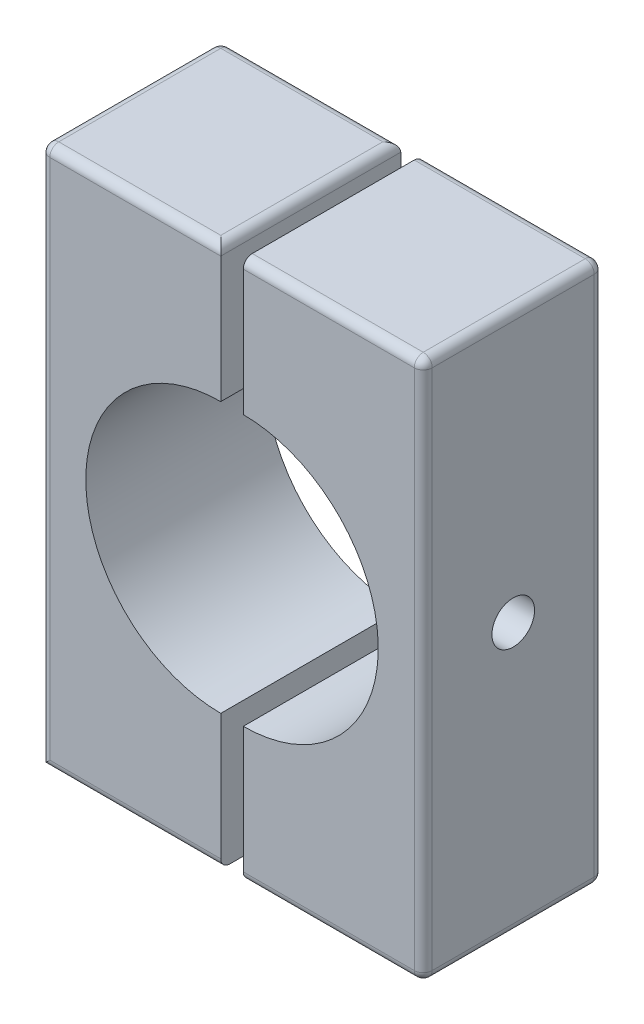
ISO-10303-21;
HEADER;
FILE_DESCRIPTION(('STEP AP214'),'2;1');
FILE_NAME('part.step','',(''),(''),'','','');
FILE_SCHEMA(('AUTOMOTIVE_DESIGN { 1 0 10303 214 1 1 1 1 }'));
ENDSEC;
DATA;
#1=APPLICATION_CONTEXT('core data for automotive mechanical design processes');
#2=APPLICATION_PROTOCOL_DEFINITION('international standard','automotive_design',2000,#1);
#3=PRODUCT_CONTEXT('',#1,'mechanical');
#4=PRODUCT('Part','Part','',(#3));
#5=PRODUCT_RELATED_PRODUCT_CATEGORY('part','',(#4));
#6=PRODUCT_DEFINITION_FORMATION('','',#4);
#7=PRODUCT_DEFINITION_CONTEXT('part definition',#1,'design');
#8=PRODUCT_DEFINITION('design','',#6,#7);
#9=PRODUCT_DEFINITION_SHAPE('','',#8);
#10=(LENGTH_UNIT() NAMED_UNIT(*) SI_UNIT(.MILLI.,.METRE.));
#11=(NAMED_UNIT(*) PLANE_ANGLE_UNIT() SI_UNIT($,.RADIAN.));
#12=(NAMED_UNIT(*) SI_UNIT($,.STERADIAN.) SOLID_ANGLE_UNIT());
#13=UNCERTAINTY_MEASURE_WITH_UNIT(LENGTH_MEASURE(1.E-05),#10,'distance_accuracy_value','');
#14=(GEOMETRIC_REPRESENTATION_CONTEXT(3) GLOBAL_UNCERTAINTY_ASSIGNED_CONTEXT((#13)) GLOBAL_UNIT_ASSIGNED_CONTEXT((#10,
#11,#12)) REPRESENTATION_CONTEXT('',''));
#15=CARTESIAN_POINT('',(0.,0.,0.));
#16=DIRECTION('',(0.,0.,1.));
#17=DIRECTION('',(1.,0.,0.));
#18=AXIS2_PLACEMENT_3D('',#15,#16,#17);
#19=CARTESIAN_POINT('',(-4.9618497254431,25.0068978267383,40.));
#20=DIRECTION('',(1.,0.,0.));
#21=DIRECTION('',(0.,1.,0.));
#22=AXIS2_PLACEMENT_3D('',#19,#20,#21);
#23=PLANE('',#22);
#24=DIRECTION('',(0.,0.,-1.));
#25=VECTOR('',#24,1.);
#26=CARTESIAN_POINT('',(-4.9618497254431,25.0068978267383,40.));
#27=LINE('',#26,#25);
#28=CARTESIAN_POINT('',(-4.9618497254431,25.0068978267383,38.));
#29=VERTEX_POINT('',#28);
#30=CARTESIAN_POINT('',(-4.9618497254431,25.0068978267383,2.));
#31=VERTEX_POINT('',#30);
#32=EDGE_CURVE('E267',#29,#31,#27,.T.);
#33=ORIENTED_EDGE('',*,*,#32,.T.);
#34=CARTESIAN_POINT('',(-4.9618497254431,23.0068978267383,2.));
#35=DIRECTION('',(1.,0.,0.));
#36=DIRECTION('',(0.,1.,0.));
#37=AXIS2_PLACEMENT_3D('',#34,#35,#36);
#38=CIRCLE('',#37,2.);
#39=CARTESIAN_POINT('',(-4.9618497254431,23.0068978267383,0.));
#40=VERTEX_POINT('',#39);
#41=EDGE_CURVE('E193',#31,#40,#38,.F.);
#42=ORIENTED_EDGE('',*,*,#41,.T.);
#43=DIRECTION('',(0.,-1.,0.));
#44=VECTOR('',#43,1.);
#45=CARTESIAN_POINT('',(-4.9618497254431,25.0068978267383,0.));
#46=LINE('',#45,#44);
#47=CARTESIAN_POINT('',(-4.96184972544309,-4.99310217326171,0.));
#48=VERTEX_POINT('',#47);
#49=EDGE_CURVE('E159',#40,#48,#46,.T.);
#50=ORIENTED_EDGE('',*,*,#49,.T.);
#51=DIRECTION('',(0.,0.,-1.));
#52=VECTOR('',#51,1.);
#53=CARTESIAN_POINT('',(-4.96184972544309,-4.99310217326171,40.));
#54=LINE('',#53,#52);
#55=CARTESIAN_POINT('',(-4.96184972544309,-4.99310217326171,40.));
#56=VERTEX_POINT('',#55);
#57=EDGE_CURVE('E151',#56,#48,#54,.T.);
#58=ORIENTED_EDGE('',*,*,#57,.F.);
#59=DIRECTION('',(0.,-1.,0.));
#60=VECTOR('',#59,1.);
#61=CARTESIAN_POINT('',(-4.9618497254431,25.0068978267383,40.));
#62=LINE('',#61,#60);
#63=CARTESIAN_POINT('',(-4.9618497254431,23.0068978267383,40.));
#64=VERTEX_POINT('',#63);
#65=EDGE_CURVE('E135',#64,#56,#62,.T.);
#66=ORIENTED_EDGE('',*,*,#65,.F.);
#67=CARTESIAN_POINT('',(-4.9618497254431,23.0068978267383,38.));
#68=DIRECTION('',(1.,0.,0.));
#69=DIRECTION('',(0.,1.,0.));
#70=AXIS2_PLACEMENT_3D('',#67,#68,#69);
#71=CIRCLE('',#70,2.);
#72=EDGE_CURVE('E191',#64,#29,#71,.F.);
#73=ORIENTED_EDGE('',*,*,#72,.T.);
#74=EDGE_LOOP('',(#33,#42,#50,#58,#66,#73));
#75=FACE_BOUND('',#74,.T.);
#76=ADVANCED_FACE('F45',(#75),#23,.F.);
#77=CARTESIAN_POINT('',(-4.96184972544312,-34.9931021732617,40.));
#78=DIRECTION('',(0.,0.,-1.));
#79=DIRECTION('',(-1.,0.,0.));
#80=AXIS2_PLACEMENT_3D('',#77,#78,#79);
#81=CYLINDRICAL_SURFACE('',#80,30.);
#82=CARTESIAN_POINT('',(-4.96184972544312,-34.9931021732617,0.));
#83=DIRECTION('',(0.,0.,-1.));
#84=DIRECTION('',(-1.,0.,0.));
#85=AXIS2_PLACEMENT_3D('',#82,#83,#84);
#86=CIRCLE('',#85,30.);
#87=CARTESIAN_POINT('',(-4.96184972544309,-64.9931021732617,0.));
#88=VERTEX_POINT('',#87);
#89=EDGE_CURVE('E262',#48,#88,#86,.T.);
#90=ORIENTED_EDGE('',*,*,#89,.T.);
#91=DIRECTION('',(0.,0.,-1.));
#92=VECTOR('',#91,1.);
#93=CARTESIAN_POINT('',(-4.96184972544309,-64.9931021732617,40.));
#94=LINE('',#93,#92);
#95=CARTESIAN_POINT('',(-4.96184972544309,-64.9931021732617,40.));
#96=VERTEX_POINT('',#95);
#97=EDGE_CURVE('E153',#96,#88,#94,.T.);
#98=ORIENTED_EDGE('',*,*,#97,.F.);
#99=CARTESIAN_POINT('',(-4.96184972544312,-34.9931021732617,40.));
#100=DIRECTION('',(0.,0.,-1.));
#101=DIRECTION('',(-1.,0.,0.));
#102=AXIS2_PLACEMENT_3D('',#99,#100,#101);
#103=CIRCLE('',#102,30.);
#104=EDGE_CURVE('E139',#56,#96,#103,.T.);
#105=ORIENTED_EDGE('',*,*,#104,.F.);
#106=ORIENTED_EDGE('',*,*,#57,.T.);
#107=EDGE_LOOP('',(#90,#98,#105,#106));
#108=FACE_BOUND('',#107,.T.);
#109=ADVANCED_FACE('F150',(#108),#81,.F.);
#110=CARTESIAN_POINT('',(-4.96184972544309,-64.9931021732617,40.));
#111=DIRECTION('',(1.,0.,0.));
#112=DIRECTION('',(0.,1.,0.));
#113=AXIS2_PLACEMENT_3D('',#110,#111,#112);
#114=PLANE('',#113);
#115=DIRECTION('',(0.,0.,-1.));
#116=VECTOR('',#115,1.);
#117=CARTESIAN_POINT('',(-4.96184972544308,-94.9931021732617,40.));
#118=LINE('',#117,#116);
#119=CARTESIAN_POINT('',(-4.96184972544308,-94.9931021732617,38.));
#120=VERTEX_POINT('',#119);
#121=CARTESIAN_POINT('',(-4.96184972544308,-94.9931021732617,2.));
#122=VERTEX_POINT('',#121);
#123=EDGE_CURVE('E166',#120,#122,#118,.T.);
#124=ORIENTED_EDGE('',*,*,#123,.F.);
#125=CARTESIAN_POINT('',(-4.96184972544308,-92.9931021732617,38.));
#126=DIRECTION('',(1.,0.,0.));
#127=DIRECTION('',(0.,1.,0.));
#128=AXIS2_PLACEMENT_3D('',#125,#126,#127);
#129=CIRCLE('',#128,2.);
#130=CARTESIAN_POINT('',(-4.96184972544308,-92.9931021732617,40.));
#131=VERTEX_POINT('',#130);
#132=EDGE_CURVE('E223',#120,#131,#129,.F.);
#133=ORIENTED_EDGE('',*,*,#132,.T.);
#134=DIRECTION('',(0.,-1.,0.));
#135=VECTOR('',#134,1.);
#136=CARTESIAN_POINT('',(-4.96184972544309,-64.9931021732617,40.));
#137=LINE('',#136,#135);
#138=EDGE_CURVE('E155',#96,#131,#137,.T.);
#139=ORIENTED_EDGE('',*,*,#138,.F.);
#140=ORIENTED_EDGE('',*,*,#97,.T.);
#141=DIRECTION('',(0.,-1.,0.));
#142=VECTOR('',#141,1.);
#143=CARTESIAN_POINT('',(-4.96184972544309,-64.9931021732617,0.));
#144=LINE('',#143,#142);
#145=CARTESIAN_POINT('',(-4.96184972544308,-92.9931021732617,0.));
#146=VERTEX_POINT('',#145);
#147=EDGE_CURVE('E146',#88,#146,#144,.T.);
#148=ORIENTED_EDGE('',*,*,#147,.T.);
#149=CARTESIAN_POINT('',(-4.96184972544308,-92.9931021732617,2.));
#150=DIRECTION('',(1.,0.,0.));
#151=DIRECTION('',(0.,1.,0.));
#152=AXIS2_PLACEMENT_3D('',#149,#150,#151);
#153=CIRCLE('',#152,2.);
#154=EDGE_CURVE('E176',#146,#122,#153,.F.);
#155=ORIENTED_EDGE('',*,*,#154,.T.);
#156=EDGE_LOOP('',(#124,#133,#139,#140,#148,#155));
#157=FACE_BOUND('',#156,.T.);
#158=ADVANCED_FACE('F260',(#157),#114,.F.);
#159=CARTESIAN_POINT('',(-4.96184972544308,-94.9931021732617,40.));
#160=DIRECTION('',(0.,1.,0.));
#161=DIRECTION('',(0.,0.,1.));
#162=AXIS2_PLACEMENT_3D('',#159,#160,#161);
#163=PLANE('',#162);
#164=DIRECTION('',(0.,0.,-1.));
#165=VECTOR('',#164,1.);
#166=CARTESIAN_POINT('',(33.0381502745569,-94.9931021732617,40.));
#167=LINE('',#166,#165);
#168=CARTESIAN_POINT('',(33.0381502745569,-94.9931021732617,2.));
#169=VERTEX_POINT('',#168);
#170=CARTESIAN_POINT('',(33.0381502745569,-94.9931021732617,38.));
#171=VERTEX_POINT('',#170);
#172=EDGE_CURVE('E219',#169,#171,#167,.F.);
#173=ORIENTED_EDGE('',*,*,#172,.T.);
#174=DIRECTION('',(1.,0.,0.));
#175=VECTOR('',#174,1.);
#176=CARTESIAN_POINT('',(-4.96184972544308,-94.9931021732617,38.));
#177=LINE('',#176,#175);
#178=EDGE_CURVE('E221',#171,#120,#177,.F.);
#179=ORIENTED_EDGE('',*,*,#178,.T.);
#180=ORIENTED_EDGE('',*,*,#123,.T.);
#181=DIRECTION('',(1.,0.,0.));
#182=VECTOR('',#181,1.);
#183=CARTESIAN_POINT('',(35.0381502745569,-94.9931021732617,2.));
#184=LINE('',#183,#182);
#185=EDGE_CURVE('E161',#122,#169,#184,.T.);
#186=ORIENTED_EDGE('',*,*,#185,.T.);
#187=EDGE_LOOP('',(#173,#179,#180,#186));
#188=FACE_BOUND('',#187,.T.);
#189=ADVANCED_FACE('F269',(#188),#163,.F.);
#190=CARTESIAN_POINT('',(35.0381502745569,25.0068978267383,40.));
#191=DIRECTION('',(-1.,0.,0.));
#192=DIRECTION('',(0.,-1.,0.));
#193=AXIS2_PLACEMENT_3D('',#190,#191,#192);
#194=PLANE('',#193);
#195=CARTESIAN_POINT('',(35.0381502745569,-34.9931021732617,20.));
#196=DIRECTION('',(1.,0.,0.));
#197=DIRECTION('',(0.,1.,0.));
#198=AXIS2_PLACEMENT_3D('',#195,#196,#197);
#199=CIRCLE('',#198,4.73931576144308);
#200=CARTESIAN_POINT('',(35.0381502745569,-30.2537864118186,20.));
#201=VERTEX_POINT('',#200);
#202=EDGE_CURVE('E483',#201,#201,#199,.T.);
#203=ORIENTED_EDGE('',*,*,#202,.F.);
#204=EDGE_LOOP('',(#203));
#205=FACE_BOUND('',#204,.T.);
#206=DIRECTION('',(0.,1.,0.));
#207=VECTOR('',#206,1.);
#208=CARTESIAN_POINT('',(35.0381502745569,25.0068978267383,38.));
#209=LINE('',#208,#207);
#210=CARTESIAN_POINT('',(35.0381502745569,23.0068978267383,38.));
#211=VERTEX_POINT('',#210);
#212=CARTESIAN_POINT('',(35.0381502745569,-92.9931021732617,38.));
#213=VERTEX_POINT('',#212);
#214=EDGE_CURVE('E179',#211,#213,#209,.F.);
#215=ORIENTED_EDGE('',*,*,#214,.T.);
#216=DIRECTION('',(0.,0.,-1.));
#217=VECTOR('',#216,1.);
#218=CARTESIAN_POINT('',(35.0381502745569,-92.9931021732617,40.));
#219=LINE('',#218,#217);
#220=CARTESIAN_POINT('',(35.0381502745569,-92.9931021732617,2.));
#221=VERTEX_POINT('',#220);
#222=EDGE_CURVE('E12',#213,#221,#219,.T.);
#223=ORIENTED_EDGE('',*,*,#222,.T.);
#224=DIRECTION('',(0.,1.,0.));
#225=VECTOR('',#224,1.);
#226=CARTESIAN_POINT('',(35.0381502745569,25.0068978267383,2.));
#227=LINE('',#226,#225);
#228=CARTESIAN_POINT('',(35.0381502745569,23.0068978267383,2.));
#229=VERTEX_POINT('',#228);
#230=EDGE_CURVE('E183',#221,#229,#227,.T.);
#231=ORIENTED_EDGE('',*,*,#230,.T.);
#232=DIRECTION('',(0.,0.,-1.));
#233=VECTOR('',#232,1.);
#234=CARTESIAN_POINT('',(35.0381502745569,23.0068978267383,40.));
#235=LINE('',#234,#233);
#236=EDGE_CURVE('E181',#229,#211,#235,.F.);
#237=ORIENTED_EDGE('',*,*,#236,.T.);
#238=EDGE_LOOP('',(#215,#223,#231,#237));
#239=FACE_BOUND('',#238,.T.);
#240=ADVANCED_FACE('F367',(#205,#239),#194,.F.);
#241=CARTESIAN_POINT('',(-4.9618497254431,25.0068978267383,40.));
#242=DIRECTION('',(0.,-1.,0.));
#243=DIRECTION('',(0.,0.,-1.));
#244=AXIS2_PLACEMENT_3D('',#241,#242,#243);
#245=PLANE('',#244);
#246=DIRECTION('',(0.,0.,-1.));
#247=VECTOR('',#246,1.);
#248=CARTESIAN_POINT('',(33.0381502745569,25.0068978267383,40.));
#249=LINE('',#248,#247);
#250=CARTESIAN_POINT('',(33.0381502745569,25.0068978267383,38.));
#251=VERTEX_POINT('',#250);
#252=CARTESIAN_POINT('',(33.0381502745569,25.0068978267383,2.));
#253=VERTEX_POINT('',#252);
#254=EDGE_CURVE('E185',#251,#253,#249,.T.);
#255=ORIENTED_EDGE('',*,*,#254,.T.);
#256=DIRECTION('',(-1.,0.,0.));
#257=VECTOR('',#256,1.);
#258=CARTESIAN_POINT('',(-4.9618497254431,25.0068978267383,2.));
#259=LINE('',#258,#257);
#260=EDGE_CURVE('E189',#253,#31,#259,.T.);
#261=ORIENTED_EDGE('',*,*,#260,.T.);
#262=ORIENTED_EDGE('',*,*,#32,.F.);
#263=DIRECTION('',(-1.,0.,0.));
#264=VECTOR('',#263,1.);
#265=CARTESIAN_POINT('',(-4.9618497254431,25.0068978267383,38.));
#266=LINE('',#265,#264);
#267=EDGE_CURVE('E187',#29,#251,#266,.F.);
#268=ORIENTED_EDGE('',*,*,#267,.T.);
#269=EDGE_LOOP('',(#255,#261,#262,#268));
#270=FACE_BOUND('',#269,.T.);
#271=ADVANCED_FACE('F288',(#270),#245,.F.);
#272=CARTESIAN_POINT('',(-4.96184972544312,-34.9931021732617,40.));
#273=DIRECTION('',(0.,0.,-1.));
#274=DIRECTION('',(-1.,0.,0.));
#275=AXIS2_PLACEMENT_3D('',#272,#273,#274);
#276=PLANE('',#275);
#277=ORIENTED_EDGE('',*,*,#138,.T.);
#278=DIRECTION('',(1.,0.,0.));
#279=VECTOR('',#278,1.);
#280=CARTESIAN_POINT('',(-4.96184972544312,-92.9931021732617,40.));
#281=LINE('',#280,#279);
#282=CARTESIAN_POINT('',(33.0381502745569,-92.9931021732617,40.));
#283=VERTEX_POINT('',#282);
#284=EDGE_CURVE('E198',#131,#283,#281,.T.);
#285=ORIENTED_EDGE('',*,*,#284,.T.);
#286=DIRECTION('',(0.,1.,0.));
#287=VECTOR('',#286,1.);
#288=CARTESIAN_POINT('',(33.0381502745569,-34.9931021732617,40.));
#289=LINE('',#288,#287);
#290=CARTESIAN_POINT('',(33.0381502745569,23.0068978267383,40.));
#291=VERTEX_POINT('',#290);
#292=EDGE_CURVE('E195',#283,#291,#289,.T.);
#293=ORIENTED_EDGE('',*,*,#292,.T.);
#294=DIRECTION('',(-1.,0.,0.));
#295=VECTOR('',#294,1.);
#296=CARTESIAN_POINT('',(-4.96184972544312,23.0068978267383,40.));
#297=LINE('',#296,#295);
#298=EDGE_CURVE('E142',#291,#64,#297,.T.);
#299=ORIENTED_EDGE('',*,*,#298,.T.);
#300=ORIENTED_EDGE('',*,*,#65,.T.);
#301=ORIENTED_EDGE('',*,*,#104,.T.);
#302=EDGE_LOOP('',(#277,#285,#293,#299,#300,#301));
#303=FACE_BOUND('',#302,.T.);
#304=ADVANCED_FACE('F138',(#303),#276,.F.);
#305=CARTESIAN_POINT('',(-4.96184972544312,-34.9931021732617,0.));
#306=DIRECTION('',(0.,0.,-1.));
#307=DIRECTION('',(-1.,0.,0.));
#308=AXIS2_PLACEMENT_3D('',#305,#306,#307);
#309=PLANE('',#308);
#310=DIRECTION('',(0.,1.,0.));
#311=VECTOR('',#310,1.);
#312=CARTESIAN_POINT('',(33.0381502745569,-94.9931021732617,0.));
#313=LINE('',#312,#311);
#314=CARTESIAN_POINT('',(33.0381502745569,23.0068978267383,0.));
#315=VERTEX_POINT('',#314);
#316=CARTESIAN_POINT('',(33.0381502745569,-92.9931021732617,0.));
#317=VERTEX_POINT('',#316);
#318=EDGE_CURVE('E171',#315,#317,#313,.F.);
#319=ORIENTED_EDGE('',*,*,#318,.T.);
#320=DIRECTION('',(1.,0.,0.));
#321=VECTOR('',#320,1.);
#322=CARTESIAN_POINT('',(-4.96184972544308,-92.9931021732617,0.));
#323=LINE('',#322,#321);
#324=EDGE_CURVE('E174',#317,#146,#323,.F.);
#325=ORIENTED_EDGE('',*,*,#324,.T.);
#326=ORIENTED_EDGE('',*,*,#147,.F.);
#327=ORIENTED_EDGE('',*,*,#89,.F.);
#328=ORIENTED_EDGE('',*,*,#49,.F.);
#329=DIRECTION('',(-1.,0.,0.));
#330=VECTOR('',#329,1.);
#331=CARTESIAN_POINT('',(35.0381502745569,23.0068978267383,0.));
#332=LINE('',#331,#330);
#333=EDGE_CURVE('E164',#40,#315,#332,.F.);
#334=ORIENTED_EDGE('',*,*,#333,.T.);
#335=EDGE_LOOP('',(#319,#325,#326,#327,#328,#334));
#336=FACE_BOUND('',#335,.T.);
#337=ADVANCED_FACE('F249',(#336),#309,.T.);
#338=CARTESIAN_POINT('',(33.0381502745569,-34.9931021732617,38.));
#339=DIRECTION('',(0.,1.,0.));
#340=DIRECTION('',(-1.,0.,0.));
#341=AXIS2_PLACEMENT_3D('',#338,#339,#340);
#342=CYLINDRICAL_SURFACE('',#341,2.);
#343=ORIENTED_EDGE('',*,*,#292,.F.);
#344=CARTESIAN_POINT('',(33.0381502745569,-92.9931021732617,38.));
#345=DIRECTION('',(0.,1.,0.));
#346=DIRECTION('',(-1.,0.,0.));
#347=AXIS2_PLACEMENT_3D('',#344,#345,#346);
#348=CIRCLE('',#347,2.);
#349=EDGE_CURVE('E68',#283,#213,#348,.T.);
#350=ORIENTED_EDGE('',*,*,#349,.T.);
#351=ORIENTED_EDGE('',*,*,#214,.F.);
#352=CARTESIAN_POINT('',(33.0381502745569,23.0068978267383,38.));
#353=DIRECTION('',(0.,1.,0.));
#354=DIRECTION('',(0.,0.,1.));
#355=AXIS2_PLACEMENT_3D('',#352,#353,#354);
#356=CIRCLE('',#355,2.);
#357=EDGE_CURVE('E214',#291,#211,#356,.T.);
#358=ORIENTED_EDGE('',*,*,#357,.F.);
#359=EDGE_LOOP('',(#343,#350,#351,#358));
#360=FACE_BOUND('',#359,.T.);
#361=ADVANCED_FACE('F276',(#360),#342,.T.);
#362=CARTESIAN_POINT('',(-4.96184972544312,23.0068978267383,38.));
#363=DIRECTION('',(-1.,0.,0.));
#364=DIRECTION('',(0.,0.,1.));
#365=AXIS2_PLACEMENT_3D('',#362,#363,#364);
#366=CYLINDRICAL_SURFACE('',#365,2.);
#367=ORIENTED_EDGE('',*,*,#72,.F.);
#368=ORIENTED_EDGE('',*,*,#298,.F.);
#369=CARTESIAN_POINT('',(33.0381502745569,23.0068978267383,38.));
#370=DIRECTION('',(1.,0.,0.));
#371=DIRECTION('',(0.,0.,-1.));
#372=AXIS2_PLACEMENT_3D('',#369,#370,#371);
#373=CIRCLE('',#372,2.);
#374=EDGE_CURVE('E211',#251,#291,#373,.T.);
#375=ORIENTED_EDGE('',*,*,#374,.F.);
#376=ORIENTED_EDGE('',*,*,#267,.F.);
#377=EDGE_LOOP('',(#367,#368,#375,#376));
#378=FACE_BOUND('',#377,.T.);
#379=ADVANCED_FACE('F284',(#378),#366,.T.);
#380=CARTESIAN_POINT('',(33.0381502745569,23.0068978267383,38.));
#381=DIRECTION('',(0.,0.,1.));
#382=DIRECTION('',(1.,0.,0.));
#383=AXIS2_PLACEMENT_3D('',#380,#381,#382);
#384=SPHERICAL_SURFACE('',#383,2.);
#385=ORIENTED_EDGE('',*,*,#374,.T.);
#386=ORIENTED_EDGE('',*,*,#357,.T.);
#387=CARTESIAN_POINT('',(33.0381502745569,23.0068978267383,38.));
#388=DIRECTION('',(0.,0.,1.));
#389=DIRECTION('',(1.,0.,0.));
#390=AXIS2_PLACEMENT_3D('',#387,#388,#389);
#391=CIRCLE('',#390,2.);
#392=EDGE_CURVE('E208',#251,#211,#391,.F.);
#393=ORIENTED_EDGE('',*,*,#392,.F.);
#394=EDGE_LOOP('',(#385,#386,#393));
#395=FACE_BOUND('',#394,.T.);
#396=ADVANCED_FACE('F280',(#395),#384,.T.);
#397=CARTESIAN_POINT('',(33.0381502745569,23.0068978267383,40.));
#398=DIRECTION('',(0.,0.,-1.));
#399=DIRECTION('',(-1.,0.,0.));
#400=AXIS2_PLACEMENT_3D('',#397,#398,#399);
#401=CYLINDRICAL_SURFACE('',#400,2.);
#402=ORIENTED_EDGE('',*,*,#392,.T.);
#403=ORIENTED_EDGE('',*,*,#236,.F.);
#404=CARTESIAN_POINT('',(33.0381502745569,23.0068978267383,2.));
#405=DIRECTION('',(0.,0.,-1.));
#406=DIRECTION('',(-1.,0.,0.));
#407=AXIS2_PLACEMENT_3D('',#404,#405,#406);
#408=CIRCLE('',#407,2.);
#409=EDGE_CURVE('E205',#253,#229,#408,.T.);
#410=ORIENTED_EDGE('',*,*,#409,.F.);
#411=ORIENTED_EDGE('',*,*,#254,.F.);
#412=EDGE_LOOP('',(#402,#403,#410,#411));
#413=FACE_BOUND('',#412,.T.);
#414=ADVANCED_FACE('F296',(#413),#401,.T.);
#415=CARTESIAN_POINT('',(-4.9618497254431,23.0068978267383,2.));
#416=DIRECTION('',(1.,0.,0.));
#417=DIRECTION('',(0.,0.,-1.));
#418=AXIS2_PLACEMENT_3D('',#415,#416,#417);
#419=CYLINDRICAL_SURFACE('',#418,2.);
#420=ORIENTED_EDGE('',*,*,#41,.F.);
#421=ORIENTED_EDGE('',*,*,#260,.F.);
#422=CARTESIAN_POINT('',(33.0381502745569,23.0068978267383,2.));
#423=DIRECTION('',(1.,0.,0.));
#424=DIRECTION('',(0.,0.,-1.));
#425=AXIS2_PLACEMENT_3D('',#422,#423,#424);
#426=CIRCLE('',#425,2.);
#427=EDGE_CURVE('E202',#315,#253,#426,.T.);
#428=ORIENTED_EDGE('',*,*,#427,.F.);
#429=ORIENTED_EDGE('',*,*,#333,.F.);
#430=EDGE_LOOP('',(#420,#421,#428,#429));
#431=FACE_BOUND('',#430,.T.);
#432=ADVANCED_FACE('F292',(#431),#419,.T.);
#433=CARTESIAN_POINT('',(33.0381502745569,23.0068978267383,2.));
#434=DIRECTION('',(0.,0.,1.));
#435=DIRECTION('',(1.,0.,0.));
#436=AXIS2_PLACEMENT_3D('',#433,#434,#435);
#437=SPHERICAL_SURFACE('',#436,2.);
#438=ORIENTED_EDGE('',*,*,#427,.T.);
#439=ORIENTED_EDGE('',*,*,#409,.T.);
#440=CARTESIAN_POINT('',(33.0381502745569,23.0068978267383,2.));
#441=DIRECTION('',(0.,1.,0.));
#442=DIRECTION('',(0.,0.,1.));
#443=AXIS2_PLACEMENT_3D('',#440,#441,#442);
#444=CIRCLE('',#443,2.);
#445=EDGE_CURVE('E199',#315,#229,#444,.F.);
#446=ORIENTED_EDGE('',*,*,#445,.F.);
#447=EDGE_LOOP('',(#438,#439,#446));
#448=FACE_BOUND('',#447,.T.);
#449=ADVANCED_FACE('F298',(#448),#437,.T.);
#450=CARTESIAN_POINT('',(33.0381502745569,25.0068978267383,2.));
#451=DIRECTION('',(0.,-1.,0.));
#452=DIRECTION('',(1.,0.,0.));
#453=AXIS2_PLACEMENT_3D('',#450,#451,#452);
#454=CYLINDRICAL_SURFACE('',#453,2.);
#455=ORIENTED_EDGE('',*,*,#230,.F.);
#456=CARTESIAN_POINT('',(33.0381502745569,-92.9931021732617,2.));
#457=DIRECTION('',(0.,-1.,0.));
#458=DIRECTION('',(1.,0.,0.));
#459=AXIS2_PLACEMENT_3D('',#456,#457,#458);
#460=CIRCLE('',#459,2.);
#461=EDGE_CURVE('E54',#221,#317,#460,.F.);
#462=ORIENTED_EDGE('',*,*,#461,.T.);
#463=ORIENTED_EDGE('',*,*,#318,.F.);
#464=ORIENTED_EDGE('',*,*,#445,.T.);
#465=EDGE_LOOP('',(#455,#462,#463,#464));
#466=FACE_BOUND('',#465,.T.);
#467=ADVANCED_FACE('F246',(#466),#454,.T.);
#468=CARTESIAN_POINT('',(-4.96184972544308,-92.9931021732617,2.));
#469=DIRECTION('',(-1.,0.,0.));
#470=DIRECTION('',(0.,0.,1.));
#471=AXIS2_PLACEMENT_3D('',#468,#469,#470);
#472=CYLINDRICAL_SURFACE('',#471,2.);
#473=ORIENTED_EDGE('',*,*,#324,.F.);
#474=CARTESIAN_POINT('',(33.0381502745569,-92.9931021732617,2.));
#475=DIRECTION('',(-1.,0.,0.));
#476=DIRECTION('',(0.,0.,1.));
#477=AXIS2_PLACEMENT_3D('',#474,#475,#476);
#478=CIRCLE('',#477,2.);
#479=EDGE_CURVE('E226',#317,#169,#478,.T.);
#480=ORIENTED_EDGE('',*,*,#479,.T.);
#481=ORIENTED_EDGE('',*,*,#185,.F.);
#482=ORIENTED_EDGE('',*,*,#154,.F.);
#483=EDGE_LOOP('',(#473,#480,#481,#482));
#484=FACE_BOUND('',#483,.T.);
#485=ADVANCED_FACE('F256',(#484),#472,.T.);
#486=CARTESIAN_POINT('',(33.0381502745569,-92.9931021732617,2.));
#487=DIRECTION('',(0.,0.,1.));
#488=DIRECTION('',(1.,0.,0.));
#489=AXIS2_PLACEMENT_3D('',#486,#487,#488);
#490=SPHERICAL_SURFACE('',#489,2.);
#491=ORIENTED_EDGE('',*,*,#479,.F.);
#492=ORIENTED_EDGE('',*,*,#461,.F.);
#493=CARTESIAN_POINT('',(33.0381502745569,-92.9931021732617,2.));
#494=DIRECTION('',(0.,0.,1.));
#495=DIRECTION('',(1.,0.,0.));
#496=AXIS2_PLACEMENT_3D('',#493,#494,#495);
#497=CIRCLE('',#496,2.);
#498=EDGE_CURVE('E49',#169,#221,#497,.T.);
#499=ORIENTED_EDGE('',*,*,#498,.F.);
#500=EDGE_LOOP('',(#491,#492,#499));
#501=FACE_BOUND('',#500,.T.);
#502=ADVANCED_FACE('F47',(#501),#490,.T.);
#503=CARTESIAN_POINT('',(33.0381502745569,-92.9931021732617,40.));
#504=DIRECTION('',(0.,0.,-1.));
#505=DIRECTION('',(-1.,0.,0.));
#506=AXIS2_PLACEMENT_3D('',#503,#504,#505);
#507=CYLINDRICAL_SURFACE('',#506,2.);
#508=ORIENTED_EDGE('',*,*,#498,.T.);
#509=ORIENTED_EDGE('',*,*,#222,.F.);
#510=CARTESIAN_POINT('',(33.0381502745569,-92.9931021732617,38.));
#511=DIRECTION('',(0.,0.,1.));
#512=DIRECTION('',(1.,0.,0.));
#513=AXIS2_PLACEMENT_3D('',#510,#511,#512);
#514=CIRCLE('',#513,2.);
#515=EDGE_CURVE('E230',#171,#213,#514,.T.);
#516=ORIENTED_EDGE('',*,*,#515,.F.);
#517=ORIENTED_EDGE('',*,*,#172,.F.);
#518=EDGE_LOOP('',(#508,#509,#516,#517));
#519=FACE_BOUND('',#518,.T.);
#520=ADVANCED_FACE('F240',(#519),#507,.T.);
#521=CARTESIAN_POINT('',(33.0381502745569,-92.9931021732617,38.));
#522=DIRECTION('',(0.,1.,0.));
#523=DIRECTION('',(0.,0.,1.));
#524=AXIS2_PLACEMENT_3D('',#521,#522,#523);
#525=SPHERICAL_SURFACE('',#524,2.);
#526=ORIENTED_EDGE('',*,*,#515,.T.);
#527=ORIENTED_EDGE('',*,*,#349,.F.);
#528=CARTESIAN_POINT('',(33.0381502745569,-92.9931021732617,38.));
#529=DIRECTION('',(-1.,0.,0.));
#530=DIRECTION('',(0.,0.,1.));
#531=AXIS2_PLACEMENT_3D('',#528,#529,#530);
#532=CIRCLE('',#531,2.);
#533=EDGE_CURVE('E229',#171,#283,#532,.T.);
#534=ORIENTED_EDGE('',*,*,#533,.F.);
#535=EDGE_LOOP('',(#526,#527,#534));
#536=FACE_BOUND('',#535,.T.);
#537=ADVANCED_FACE('F274',(#536),#525,.T.);
#538=CARTESIAN_POINT('',(-4.96184972544312,-92.9931021732617,38.));
#539=DIRECTION('',(1.,0.,0.));
#540=DIRECTION('',(0.,0.,-1.));
#541=AXIS2_PLACEMENT_3D('',#538,#539,#540);
#542=CYLINDRICAL_SURFACE('',#541,2.);
#543=ORIENTED_EDGE('',*,*,#132,.F.);
#544=ORIENTED_EDGE('',*,*,#178,.F.);
#545=ORIENTED_EDGE('',*,*,#533,.T.);
#546=ORIENTED_EDGE('',*,*,#284,.F.);
#547=EDGE_LOOP('',(#543,#544,#545,#546));
#548=FACE_BOUND('',#547,.T.);
#549=ADVANCED_FACE('F272',(#548),#542,.T.);
#550=CARTESIAN_POINT('',(27.0381502745569,-34.9931021732617,20.));
#551=DIRECTION('',(1.,0.,0.));
#552=DIRECTION('',(0.,1.,0.));
#553=AXIS2_PLACEMENT_3D('',#550,#551,#552);
#554=CYLINDRICAL_SURFACE('',#553,4.73931576144308);
#555=CARTESIAN_POINT('',(27.0381502745569,-34.9931021732617,20.));
#556=DIRECTION('',(1.,0.,0.));
#557=DIRECTION('',(0.,1.,0.));
#558=AXIS2_PLACEMENT_3D('',#555,#556,#557);
#559=CIRCLE('',#558,4.73931576144308);
#560=CARTESIAN_POINT('',(27.0381502745569,-30.2537864118186,20.));
#561=VERTEX_POINT('',#560);
#562=EDGE_CURVE('E231',#561,#561,#559,.T.);
#563=ORIENTED_EDGE('',*,*,#562,.F.);
#564=EDGE_LOOP('',(#563));
#565=FACE_BOUND('',#564,.T.);
#566=ORIENTED_EDGE('',*,*,#202,.T.);
#567=EDGE_LOOP('',(#566));
#568=FACE_BOUND('',#567,.T.);
#569=ADVANCED_FACE('F329',(#565,#568),#554,.F.);
#570=CARTESIAN_POINT('',(27.0381502745569,-34.9931021732617,20.));
#571=DIRECTION('',(1.,0.,0.));
#572=DIRECTION('',(0.,1.,0.));
#573=AXIS2_PLACEMENT_3D('',#570,#571,#572);
#574=PLANE('',#573);
#575=ORIENTED_EDGE('',*,*,#562,.T.);
#576=EDGE_LOOP('',(#575));
#577=FACE_BOUND('',#576,.T.);
#578=ADVANCED_FACE('F441',(#577),#574,.T.);
#579=CLOSED_SHELL('',(#76,#109,#158,#189,#240,#271,#304,#337,#361,#379,#396,#414,#432,#449,#467,
#485,#502,#520,#537,#549,#569,#578));
#580=MANIFOLD_SOLID_BREP('B2',#579);
#581=CARTESIAN_POINT('',(-49.9618497254431,25.0068978267383,40.));
#582=DIRECTION('',(1.,0.,0.));
#583=DIRECTION('',(0.,1.,0.));
#584=AXIS2_PLACEMENT_3D('',#581,#582,#583);
#585=PLANE('',#584);
#586=CARTESIAN_POINT('',(-49.9618497254431,-34.9931021732617,20.));
#587=DIRECTION('',(-1.,0.,0.));
#588=DIRECTION('',(0.,-1.,0.));
#589=AXIS2_PLACEMENT_3D('',#586,#587,#588);
#590=CIRCLE('',#589,3.5);
#591=CARTESIAN_POINT('',(-49.9618497254431,-38.4931021732617,20.));
#592=VERTEX_POINT('',#591);
#593=EDGE_CURVE('E894',#592,#592,#590,.T.);
#594=ORIENTED_EDGE('',*,*,#593,.F.);
#595=EDGE_LOOP('',(#594));
#596=FACE_BOUND('',#595,.T.);
#597=DIRECTION('',(0.,0.,-1.));
#598=VECTOR('',#597,1.);
#599=CARTESIAN_POINT('',(-49.9618497254431,-94.9931021732617,40.));
#600=LINE('',#599,#598);
#601=CARTESIAN_POINT('',(-49.9618497254431,-94.9931021732617,38.));
#602=VERTEX_POINT('',#601);
#603=CARTESIAN_POINT('',(-49.9618497254431,-94.9931021732617,2.));
#604=VERTEX_POINT('',#603);
#605=EDGE_CURVE('E614',#602,#604,#600,.T.);
#606=ORIENTED_EDGE('',*,*,#605,.F.);
#607=DIRECTION('',(0.,-1.,0.));
#608=VECTOR('',#607,1.);
#609=CARTESIAN_POINT('',(-49.9618497254431,25.0068978267383,38.));
#610=LINE('',#609,#608);
#611=CARTESIAN_POINT('',(-49.9618497254431,23.0068978267383,38.));
#612=VERTEX_POINT('',#611);
#613=EDGE_CURVE('E637',#602,#612,#610,.F.);
#614=ORIENTED_EDGE('',*,*,#613,.T.);
#615=DIRECTION('',(0.,0.,-1.));
#616=VECTOR('',#615,1.);
#617=CARTESIAN_POINT('',(-49.9618497254431,23.0068978267383,40.));
#618=LINE('',#617,#616);
#619=CARTESIAN_POINT('',(-49.9618497254431,23.0068978267383,2.));
#620=VERTEX_POINT('',#619);
#621=EDGE_CURVE('E635',#612,#620,#618,.T.);
#622=ORIENTED_EDGE('',*,*,#621,.T.);
#623=DIRECTION('',(0.,-1.,0.));
#624=VECTOR('',#623,1.);
#625=CARTESIAN_POINT('',(-49.9618497254431,25.0068978267383,2.));
#626=LINE('',#625,#624);
#627=EDGE_CURVE('E633',#620,#604,#626,.T.);
#628=ORIENTED_EDGE('',*,*,#627,.T.);
#629=EDGE_LOOP('',(#606,#614,#622,#628));
#630=FACE_BOUND('',#629,.T.);
#631=ADVANCED_FACE('F495',(#596,#630),#585,.F.);
#632=CARTESIAN_POINT('',(-49.9618497254431,-94.9931021732617,40.));
#633=DIRECTION('',(0.,1.,0.));
#634=DIRECTION('',(0.,0.,1.));
#635=AXIS2_PLACEMENT_3D('',#632,#633,#634);
#636=PLANE('',#635);
#637=DIRECTION('',(0.,0.,-1.));
#638=VECTOR('',#637,1.);
#639=CARTESIAN_POINT('',(-9.96184972544308,-94.9931021732617,40.));
#640=LINE('',#639,#638);
#641=CARTESIAN_POINT('',(-9.96184972544308,-94.9931021732617,38.));
#642=VERTEX_POINT('',#641);
#643=CARTESIAN_POINT('',(-9.96184972544308,-94.9931021732617,2.));
#644=VERTEX_POINT('',#643);
#645=EDGE_CURVE('E596',#642,#644,#640,.T.);
#646=ORIENTED_EDGE('',*,*,#645,.F.);
#647=DIRECTION('',(1.,0.,0.));
#648=VECTOR('',#647,1.);
#649=CARTESIAN_POINT('',(-49.9618497254431,-94.9931021732617,38.));
#650=LINE('',#649,#648);
#651=EDGE_CURVE('E43',#642,#602,#650,.F.);
#652=ORIENTED_EDGE('',*,*,#651,.T.);
#653=ORIENTED_EDGE('',*,*,#605,.T.);
#654=DIRECTION('',(1.,0.,0.));
#655=VECTOR('',#654,1.);
#656=CARTESIAN_POINT('',(-49.9618497254431,-94.9931021732617,2.));
#657=LINE('',#656,#655);
#658=EDGE_CURVE('E504',#604,#644,#657,.T.);
#659=ORIENTED_EDGE('',*,*,#658,.T.);
#660=EDGE_LOOP('',(#646,#652,#653,#659));
#661=FACE_BOUND('',#660,.T.);
#662=ADVANCED_FACE('F687',(#661),#636,.F.);
#663=CARTESIAN_POINT('',(-9.96184972544309,-64.9931021732617,40.));
#664=DIRECTION('',(-1.,0.,0.));
#665=DIRECTION('',(0.,-1.,0.));
#666=AXIS2_PLACEMENT_3D('',#663,#664,#665);
#667=PLANE('',#666);
#668=DIRECTION('',(0.,1.,0.));
#669=VECTOR('',#668,1.);
#670=CARTESIAN_POINT('',(-9.96184972544309,-64.9931021732617,40.));
#671=LINE('',#670,#669);
#672=CARTESIAN_POINT('',(-9.96184972544308,-92.9931021732617,40.));
#673=VERTEX_POINT('',#672);
#674=CARTESIAN_POINT('',(-9.96184972544309,-64.9931021732617,40.));
#675=VERTEX_POINT('',#674);
#676=EDGE_CURVE('E578',#673,#675,#671,.T.);
#677=ORIENTED_EDGE('',*,*,#676,.F.);
#678=CARTESIAN_POINT('',(-9.96184972544308,-92.9931021732617,38.));
#679=DIRECTION('',(-1.,0.,0.));
#680=DIRECTION('',(0.,-1.,0.));
#681=AXIS2_PLACEMENT_3D('',#678,#679,#680);
#682=CIRCLE('',#681,2.);
#683=EDGE_CURVE('E518',#673,#642,#682,.F.);
#684=ORIENTED_EDGE('',*,*,#683,.T.);
#685=ORIENTED_EDGE('',*,*,#645,.T.);
#686=CARTESIAN_POINT('',(-9.96184972544308,-92.9931021732617,2.));
#687=DIRECTION('',(-1.,0.,0.));
#688=DIRECTION('',(0.,-1.,0.));
#689=AXIS2_PLACEMENT_3D('',#686,#687,#688);
#690=CIRCLE('',#689,2.);
#691=CARTESIAN_POINT('',(-9.96184972544308,-92.9931021732617,0.));
#692=VERTEX_POINT('',#691);
#693=EDGE_CURVE('E645',#644,#692,#690,.F.);
#694=ORIENTED_EDGE('',*,*,#693,.T.);
#695=DIRECTION('',(0.,1.,0.));
#696=VECTOR('',#695,1.);
#697=CARTESIAN_POINT('',(-9.96184972544309,-64.9931021732617,0.));
#698=LINE('',#697,#696);
#699=CARTESIAN_POINT('',(-9.96184972544309,-64.9931021732617,0.));
#700=VERTEX_POINT('',#699);
#701=EDGE_CURVE('E593',#692,#700,#698,.T.);
#702=ORIENTED_EDGE('',*,*,#701,.T.);
#703=DIRECTION('',(0.,0.,-1.));
#704=VECTOR('',#703,1.);
#705=CARTESIAN_POINT('',(-9.96184972544309,-64.9931021732617,40.));
#706=LINE('',#705,#704);
#707=EDGE_CURVE('E590',#675,#700,#706,.T.);
#708=ORIENTED_EDGE('',*,*,#707,.F.);
#709=EDGE_LOOP('',(#677,#684,#685,#694,#702,#708));
#710=FACE_BOUND('',#709,.T.);
#711=ADVANCED_FACE('F591',(#710),#667,.F.);
#712=CARTESIAN_POINT('',(-9.96184972544309,-34.9931021732617,40.));
#713=DIRECTION('',(0.,0.,-1.));
#714=DIRECTION('',(-1.,0.,0.));
#715=AXIS2_PLACEMENT_3D('',#712,#713,#714);
#716=CYLINDRICAL_SURFACE('',#715,30.);
#717=CARTESIAN_POINT('',(-9.96184972544309,-34.9931021732617,0.));
#718=DIRECTION('',(0.,0.,-1.));
#719=DIRECTION('',(1.,0.,0.));
#720=AXIS2_PLACEMENT_3D('',#717,#718,#719);
#721=CIRCLE('',#720,30.);
#722=CARTESIAN_POINT('',(-9.96184972544309,-4.9931021732617,0.));
#723=VERTEX_POINT('',#722);
#724=EDGE_CURVE('E608',#700,#723,#721,.T.);
#725=ORIENTED_EDGE('',*,*,#724,.T.);
#726=DIRECTION('',(0.,0.,-1.));
#727=VECTOR('',#726,1.);
#728=CARTESIAN_POINT('',(-9.96184972544309,-4.9931021732617,40.));
#729=LINE('',#728,#727);
#730=CARTESIAN_POINT('',(-9.96184972544309,-4.9931021732617,40.));
#731=VERTEX_POINT('',#730);
#732=EDGE_CURVE('E597',#731,#723,#729,.T.);
#733=ORIENTED_EDGE('',*,*,#732,.F.);
#734=CARTESIAN_POINT('',(-9.96184972544309,-34.9931021732617,40.));
#735=DIRECTION('',(0.,0.,-1.));
#736=DIRECTION('',(1.,0.,0.));
#737=AXIS2_PLACEMENT_3D('',#734,#735,#736);
#738=CIRCLE('',#737,30.);
#739=EDGE_CURVE('E583',#675,#731,#738,.T.);
#740=ORIENTED_EDGE('',*,*,#739,.F.);
#741=ORIENTED_EDGE('',*,*,#707,.T.);
#742=EDGE_LOOP('',(#725,#733,#740,#741));
#743=FACE_BOUND('',#742,.T.);
#744=ADVANCED_FACE('F599',(#743),#716,.F.);
#745=CARTESIAN_POINT('',(-9.9618497254431,25.0068978267383,40.));
#746=DIRECTION('',(-1.,0.,0.));
#747=DIRECTION('',(0.,-1.,0.));
#748=AXIS2_PLACEMENT_3D('',#745,#746,#747);
#749=PLANE('',#748);
#750=DIRECTION('',(0.,1.,0.));
#751=VECTOR('',#750,1.);
#752=CARTESIAN_POINT('',(-9.9618497254431,25.0068978267383,0.));
#753=LINE('',#752,#751);
#754=CARTESIAN_POINT('',(-9.9618497254431,23.0068978267383,0.));
#755=VERTEX_POINT('',#754);
#756=EDGE_CURVE('E587',#723,#755,#753,.T.);
#757=ORIENTED_EDGE('',*,*,#756,.T.);
#758=DIRECTION('',(0.,0.,-1.));
#759=VECTOR('',#758,1.);
#760=CARTESIAN_POINT('',(-9.9618497254431,23.0068978267383,40.));
#761=LINE('',#760,#759);
#762=CARTESIAN_POINT('',(-9.9618497254431,23.0068978267383,40.));
#763=VERTEX_POINT('',#762);
#764=EDGE_CURVE('E625',#755,#763,#761,.F.);
#765=ORIENTED_EDGE('',*,*,#764,.T.);
#766=DIRECTION('',(0.,1.,0.));
#767=VECTOR('',#766,1.);
#768=CARTESIAN_POINT('',(-9.9618497254431,25.0068978267383,40.));
#769=LINE('',#768,#767);
#770=EDGE_CURVE('E602',#731,#763,#769,.T.);
#771=ORIENTED_EDGE('',*,*,#770,.F.);
#772=ORIENTED_EDGE('',*,*,#732,.T.);
#773=EDGE_LOOP('',(#757,#765,#771,#772));
#774=FACE_BOUND('',#773,.T.);
#775=ADVANCED_FACE('F710',(#774),#749,.F.);
#776=CARTESIAN_POINT('',(-49.9618497254431,25.0068978267383,40.));
#777=DIRECTION('',(0.,-1.,0.));
#778=DIRECTION('',(0.,0.,-1.));
#779=AXIS2_PLACEMENT_3D('',#776,#777,#778);
#780=PLANE('',#779);
#781=DIRECTION('',(-1.,0.,0.));
#782=VECTOR('',#781,1.);
#783=CARTESIAN_POINT('',(-9.9618497254431,25.0068978267383,38.));
#784=LINE('',#783,#782);
#785=CARTESIAN_POINT('',(-47.9618497254431,25.0068978267383,38.));
#786=VERTEX_POINT('',#785);
#787=CARTESIAN_POINT('',(-11.9618497254431,25.0068978267383,38.));
#788=VERTEX_POINT('',#787);
#789=EDGE_CURVE('E620',#786,#788,#784,.F.);
#790=ORIENTED_EDGE('',*,*,#789,.T.);
#791=DIRECTION('',(0.,0.,-1.));
#792=VECTOR('',#791,1.);
#793=CARTESIAN_POINT('',(-11.9618497254431,25.0068978267383,40.));
#794=LINE('',#793,#792);
#795=CARTESIAN_POINT('',(-11.9618497254431,25.0068978267383,2.));
#796=VERTEX_POINT('',#795);
#797=EDGE_CURVE('E622',#788,#796,#794,.T.);
#798=ORIENTED_EDGE('',*,*,#797,.T.);
#799=DIRECTION('',(-1.,0.,0.));
#800=VECTOR('',#799,1.);
#801=CARTESIAN_POINT('',(-49.9618497254431,25.0068978267383,2.));
#802=LINE('',#801,#800);
#803=CARTESIAN_POINT('',(-47.9618497254431,25.0068978267383,2.));
#804=VERTEX_POINT('',#803);
#805=EDGE_CURVE('E616',#796,#804,#802,.T.);
#806=ORIENTED_EDGE('',*,*,#805,.T.);
#807=DIRECTION('',(0.,0.,-1.));
#808=VECTOR('',#807,1.);
#809=CARTESIAN_POINT('',(-47.9618497254431,25.0068978267383,40.));
#810=LINE('',#809,#808);
#811=EDGE_CURVE('E618',#804,#786,#810,.F.);
#812=ORIENTED_EDGE('',*,*,#811,.T.);
#813=EDGE_LOOP('',(#790,#798,#806,#812));
#814=FACE_BOUND('',#813,.T.);
#815=ADVANCED_FACE('F839',(#814),#780,.F.);
#816=CARTESIAN_POINT('',(-9.96184972544309,-34.9931021732617,40.));
#817=DIRECTION('',(0.,0.,1.));
#818=DIRECTION('',(1.,0.,0.));
#819=AXIS2_PLACEMENT_3D('',#816,#817,#818);
#820=PLANE('',#819);
#821=ORIENTED_EDGE('',*,*,#770,.T.);
#822=DIRECTION('',(-1.,0.,0.));
#823=VECTOR('',#822,1.);
#824=CARTESIAN_POINT('',(-49.9618497254431,23.0068978267383,40.));
#825=LINE('',#824,#823);
#826=CARTESIAN_POINT('',(-47.9618497254431,23.0068978267383,40.));
#827=VERTEX_POINT('',#826);
#828=EDGE_CURVE('E631',#763,#827,#825,.T.);
#829=ORIENTED_EDGE('',*,*,#828,.T.);
#830=DIRECTION('',(0.,-1.,0.));
#831=VECTOR('',#830,1.);
#832=CARTESIAN_POINT('',(-47.9618497254431,-94.9931021732617,40.));
#833=LINE('',#832,#831);
#834=CARTESIAN_POINT('',(-47.9618497254431,-92.9931021732617,40.));
#835=VERTEX_POINT('',#834);
#836=EDGE_CURVE('E628',#827,#835,#833,.T.);
#837=ORIENTED_EDGE('',*,*,#836,.T.);
#838=DIRECTION('',(1.,0.,0.));
#839=VECTOR('',#838,1.);
#840=CARTESIAN_POINT('',(-9.96184972544308,-92.9931021732617,40.));
#841=LINE('',#840,#839);
#842=EDGE_CURVE('E586',#835,#673,#841,.T.);
#843=ORIENTED_EDGE('',*,*,#842,.T.);
#844=ORIENTED_EDGE('',*,*,#676,.T.);
#845=ORIENTED_EDGE('',*,*,#739,.T.);
#846=EDGE_LOOP('',(#821,#829,#837,#843,#844,#845));
#847=FACE_BOUND('',#846,.T.);
#848=ADVANCED_FACE('F581',(#847),#820,.T.);
#849=CARTESIAN_POINT('',(-9.96184972544309,-34.9931021732617,0.));
#850=DIRECTION('',(0.,0.,1.));
#851=DIRECTION('',(1.,0.,0.));
#852=AXIS2_PLACEMENT_3D('',#849,#850,#851);
#853=PLANE('',#852);
#854=DIRECTION('',(0.,-1.,0.));
#855=VECTOR('',#854,1.);
#856=CARTESIAN_POINT('',(-47.9618497254431,-34.9931021732617,0.));
#857=LINE('',#856,#855);
#858=CARTESIAN_POINT('',(-47.9618497254431,-92.9931021732617,0.));
#859=VERTEX_POINT('',#858);
#860=CARTESIAN_POINT('',(-47.9618497254431,23.0068978267383,0.));
#861=VERTEX_POINT('',#860);
#862=EDGE_CURVE('E641',#859,#861,#857,.F.);
#863=ORIENTED_EDGE('',*,*,#862,.T.);
#864=DIRECTION('',(-1.,0.,0.));
#865=VECTOR('',#864,1.);
#866=CARTESIAN_POINT('',(-9.96184972544309,23.0068978267383,0.));
#867=LINE('',#866,#865);
#868=EDGE_CURVE('E643',#861,#755,#867,.F.);
#869=ORIENTED_EDGE('',*,*,#868,.T.);
#870=ORIENTED_EDGE('',*,*,#756,.F.);
#871=ORIENTED_EDGE('',*,*,#724,.F.);
#872=ORIENTED_EDGE('',*,*,#701,.F.);
#873=DIRECTION('',(1.,0.,0.));
#874=VECTOR('',#873,1.);
#875=CARTESIAN_POINT('',(-9.96184972544309,-92.9931021732617,0.));
#876=LINE('',#875,#874);
#877=EDGE_CURVE('E639',#692,#859,#876,.F.);
#878=ORIENTED_EDGE('',*,*,#877,.T.);
#879=EDGE_LOOP('',(#863,#869,#870,#871,#872,#878));
#880=FACE_BOUND('',#879,.T.);
#881=ADVANCED_FACE('F707',(#880),#853,.F.);
#882=CARTESIAN_POINT('',(-9.96184972544309,-92.9931021732617,38.));
#883=DIRECTION('',(-1.,0.,0.));
#884=DIRECTION('',(0.,0.,1.));
#885=AXIS2_PLACEMENT_3D('',#882,#883,#884);
#886=CYLINDRICAL_SURFACE('',#885,2.);
#887=ORIENTED_EDGE('',*,*,#683,.F.);
#888=ORIENTED_EDGE('',*,*,#842,.F.);
#889=CARTESIAN_POINT('',(-47.9618497254431,-92.9931021732617,38.));
#890=DIRECTION('',(-0.707106781186548,0.707106781186547,0.));
#891=DIRECTION('',(0.707106781186547,0.707106781186548,0.));
#892=AXIS2_PLACEMENT_3D('',#889,#890,#891);
#893=ELLIPSE('',#892,2.82842712474619,2.);
#894=EDGE_CURVE('E499',#602,#835,#893,.T.);
#895=ORIENTED_EDGE('',*,*,#894,.F.);
#896=ORIENTED_EDGE('',*,*,#651,.F.);
#897=EDGE_LOOP('',(#887,#888,#895,#896));
#898=FACE_BOUND('',#897,.T.);
#899=ADVANCED_FACE('F497',(#898),#886,.T.);
#900=CARTESIAN_POINT('',(-49.9618497254431,-92.9931021732617,2.));
#901=DIRECTION('',(1.,0.,0.));
#902=DIRECTION('',(0.,0.,-1.));
#903=AXIS2_PLACEMENT_3D('',#900,#901,#902);
#904=CYLINDRICAL_SURFACE('',#903,2.);
#905=ORIENTED_EDGE('',*,*,#693,.F.);
#906=ORIENTED_EDGE('',*,*,#658,.F.);
#907=CARTESIAN_POINT('',(-47.9618497254431,-92.9931021732617,2.));
#908=DIRECTION('',(0.707106781186548,-0.707106781186547,0.));
#909=DIRECTION('',(0.707106781186547,0.707106781186548,0.));
#910=AXIS2_PLACEMENT_3D('',#907,#908,#909);
#911=ELLIPSE('',#910,2.82842712474619,2.);
#912=EDGE_CURVE('E671',#859,#604,#911,.F.);
#913=ORIENTED_EDGE('',*,*,#912,.F.);
#914=ORIENTED_EDGE('',*,*,#877,.F.);
#915=EDGE_LOOP('',(#905,#906,#913,#914));
#916=FACE_BOUND('',#915,.T.);
#917=ADVANCED_FACE('F811',(#916),#904,.T.);
#918=CARTESIAN_POINT('',(-47.9618497254431,-34.9931021732617,38.));
#919=DIRECTION('',(0.,1.,0.));
#920=DIRECTION('',(-1.,0.,0.));
#921=AXIS2_PLACEMENT_3D('',#918,#919,#920);
#922=CYLINDRICAL_SURFACE('',#921,2.);
#923=ORIENTED_EDGE('',*,*,#894,.T.);
#924=ORIENTED_EDGE('',*,*,#836,.F.);
#925=CARTESIAN_POINT('',(-47.9618497254431,23.0068978267383,38.));
#926=DIRECTION('',(0.,1.,0.));
#927=DIRECTION('',(0.,0.,1.));
#928=AXIS2_PLACEMENT_3D('',#925,#926,#927);
#929=CIRCLE('',#928,2.);
#930=EDGE_CURVE('E669',#612,#827,#929,.T.);
#931=ORIENTED_EDGE('',*,*,#930,.F.);
#932=ORIENTED_EDGE('',*,*,#613,.F.);
#933=EDGE_LOOP('',(#923,#924,#931,#932));
#934=FACE_BOUND('',#933,.T.);
#935=ADVANCED_FACE('F682',(#934),#922,.T.);
#936=CARTESIAN_POINT('',(-47.9618497254431,23.0068978267383,40.));
#937=DIRECTION('',(0.,0.,-1.));
#938=DIRECTION('',(-1.,0.,0.));
#939=AXIS2_PLACEMENT_3D('',#936,#937,#938);
#940=CYLINDRICAL_SURFACE('',#939,2.);
#941=CARTESIAN_POINT('',(-47.9618497254431,23.0068978267383,2.));
#942=DIRECTION('',(0.,0.,-1.));
#943=DIRECTION('',(-1.,0.,0.));
#944=AXIS2_PLACEMENT_3D('',#941,#942,#943);
#945=CIRCLE('',#944,2.);
#946=EDGE_CURVE('E663',#620,#804,#945,.T.);
#947=ORIENTED_EDGE('',*,*,#946,.F.);
#948=ORIENTED_EDGE('',*,*,#621,.F.);
#949=CARTESIAN_POINT('',(-47.9618497254431,23.0068978267383,38.));
#950=DIRECTION('',(0.,0.,1.));
#951=DIRECTION('',(1.,0.,0.));
#952=AXIS2_PLACEMENT_3D('',#949,#950,#951);
#953=CIRCLE('',#952,2.);
#954=EDGE_CURVE('E666',#786,#612,#953,.T.);
#955=ORIENTED_EDGE('',*,*,#954,.F.);
#956=ORIENTED_EDGE('',*,*,#811,.F.);
#957=EDGE_LOOP('',(#947,#948,#955,#956));
#958=FACE_BOUND('',#957,.T.);
#959=ADVANCED_FACE('F696',(#958),#940,.T.);
#960=CARTESIAN_POINT('',(-47.9618497254431,25.0068978267383,2.));
#961=DIRECTION('',(0.,-1.,0.));
#962=DIRECTION('',(1.,0.,0.));
#963=AXIS2_PLACEMENT_3D('',#960,#961,#962);
#964=CYLINDRICAL_SURFACE('',#963,2.);
#965=ORIENTED_EDGE('',*,*,#912,.T.);
#966=ORIENTED_EDGE('',*,*,#627,.F.);
#967=CARTESIAN_POINT('',(-47.9618497254431,23.0068978267383,2.));
#968=DIRECTION('',(0.,1.,0.));
#969=DIRECTION('',(0.,0.,1.));
#970=AXIS2_PLACEMENT_3D('',#967,#968,#969);
#971=CIRCLE('',#970,2.);
#972=EDGE_CURVE('E660',#861,#620,#971,.T.);
#973=ORIENTED_EDGE('',*,*,#972,.F.);
#974=ORIENTED_EDGE('',*,*,#862,.F.);
#975=EDGE_LOOP('',(#965,#966,#973,#974));
#976=FACE_BOUND('',#975,.T.);
#977=ADVANCED_FACE('F692',(#976),#964,.T.);
#978=CARTESIAN_POINT('',(-47.9618497254431,23.0068978267383,38.));
#979=DIRECTION('',(0.,0.,1.));
#980=DIRECTION('',(1.,0.,0.));
#981=AXIS2_PLACEMENT_3D('',#978,#979,#980);
#982=SPHERICAL_SURFACE('',#981,2.);
#983=ORIENTED_EDGE('',*,*,#954,.T.);
#984=ORIENTED_EDGE('',*,*,#930,.T.);
#985=CARTESIAN_POINT('',(-47.9618497254431,23.0068978267383,38.));
#986=DIRECTION('',(-1.,0.,0.));
#987=DIRECTION('',(0.,0.,1.));
#988=AXIS2_PLACEMENT_3D('',#985,#986,#987);
#989=CIRCLE('',#988,2.);
#990=EDGE_CURVE('E657',#786,#827,#989,.F.);
#991=ORIENTED_EDGE('',*,*,#990,.F.);
#992=EDGE_LOOP('',(#983,#984,#991));
#993=FACE_BOUND('',#992,.T.);
#994=ADVANCED_FACE('F721',(#993),#982,.T.);
#995=CARTESIAN_POINT('',(-47.9618497254431,23.0068978267383,2.));
#996=DIRECTION('',(0.,0.,1.));
#997=DIRECTION('',(1.,0.,0.));
#998=AXIS2_PLACEMENT_3D('',#995,#996,#997);
#999=SPHERICAL_SURFACE('',#998,2.);
#1000=ORIENTED_EDGE('',*,*,#972,.T.);
#1001=ORIENTED_EDGE('',*,*,#946,.T.);
#1002=CARTESIAN_POINT('',(-47.9618497254431,23.0068978267383,2.));
#1003=DIRECTION('',(-1.,0.,0.));
#1004=DIRECTION('',(0.,0.,1.));
#1005=AXIS2_PLACEMENT_3D('',#1002,#1003,#1004);
#1006=CIRCLE('',#1005,2.);
#1007=EDGE_CURVE('E654',#861,#804,#1006,.F.);
#1008=ORIENTED_EDGE('',*,*,#1007,.F.);
#1009=EDGE_LOOP('',(#1000,#1001,#1008));
#1010=FACE_BOUND('',#1009,.T.);
#1011=ADVANCED_FACE('F699',(#1010),#999,.T.);
#1012=CARTESIAN_POINT('',(-9.96184972544309,23.0068978267383,38.));
#1013=DIRECTION('',(1.,0.,0.));
#1014=DIRECTION('',(0.,0.,-1.));
#1015=AXIS2_PLACEMENT_3D('',#1012,#1013,#1014);
#1016=CYLINDRICAL_SURFACE('',#1015,2.);
#1017=ORIENTED_EDGE('',*,*,#990,.T.);
#1018=ORIENTED_EDGE('',*,*,#828,.F.);
#1019=CARTESIAN_POINT('',(-11.9618497254431,23.0068978267383,38.));
#1020=DIRECTION('',(0.707106781186547,0.,-0.707106781186547));
#1021=DIRECTION('',(0.707106781186547,0.,0.707106781186547));
#1022=AXIS2_PLACEMENT_3D('',#1019,#1020,#1021);
#1023=ELLIPSE('',#1022,2.82842712474619,2.);
#1024=EDGE_CURVE('E651',#788,#763,#1023,.T.);
#1025=ORIENTED_EDGE('',*,*,#1024,.F.);
#1026=ORIENTED_EDGE('',*,*,#789,.F.);
#1027=EDGE_LOOP('',(#1017,#1018,#1025,#1026));
#1028=FACE_BOUND('',#1027,.T.);
#1029=ADVANCED_FACE('F718',(#1028),#1016,.T.);
#1030=CARTESIAN_POINT('',(-49.9618497254431,23.0068978267383,2.));
#1031=DIRECTION('',(-1.,0.,0.));
#1032=DIRECTION('',(0.,0.,1.));
#1033=AXIS2_PLACEMENT_3D('',#1030,#1031,#1032);
#1034=CYLINDRICAL_SURFACE('',#1033,2.);
#1035=ORIENTED_EDGE('',*,*,#1007,.T.);
#1036=ORIENTED_EDGE('',*,*,#805,.F.);
#1037=CARTESIAN_POINT('',(-11.9618497254431,23.0068978267383,2.));
#1038=DIRECTION('',(-0.707106781186547,0.,-0.707106781186547));
#1039=DIRECTION('',(-0.707106781186547,0.,0.707106781186547));
#1040=AXIS2_PLACEMENT_3D('',#1037,#1038,#1039);
#1041=ELLIPSE('',#1040,2.82842712474619,2.);
#1042=EDGE_CURVE('E649',#755,#796,#1041,.F.);
#1043=ORIENTED_EDGE('',*,*,#1042,.F.);
#1044=ORIENTED_EDGE('',*,*,#868,.F.);
#1045=EDGE_LOOP('',(#1035,#1036,#1043,#1044));
#1046=FACE_BOUND('',#1045,.T.);
#1047=ADVANCED_FACE('F704',(#1046),#1034,.T.);
#1048=CARTESIAN_POINT('',(-11.9618497254431,23.0068978267383,40.));
#1049=DIRECTION('',(0.,0.,-1.));
#1050=DIRECTION('',(-1.,0.,0.));
#1051=AXIS2_PLACEMENT_3D('',#1048,#1049,#1050);
#1052=CYLINDRICAL_SURFACE('',#1051,2.);
#1053=ORIENTED_EDGE('',*,*,#1024,.T.);
#1054=ORIENTED_EDGE('',*,*,#764,.F.);
#1055=ORIENTED_EDGE('',*,*,#1042,.T.);
#1056=ORIENTED_EDGE('',*,*,#797,.F.);
#1057=EDGE_LOOP('',(#1053,#1054,#1055,#1056));
#1058=FACE_BOUND('',#1057,.T.);
#1059=ADVANCED_FACE('F712',(#1058),#1052,.T.);
#1060=CARTESIAN_POINT('',(-41.9618497254431,-34.9931021732617,20.));
#1061=DIRECTION('',(-1.,0.,0.));
#1062=DIRECTION('',(0.,-1.,0.));
#1063=AXIS2_PLACEMENT_3D('',#1060,#1061,#1062);
#1064=CYLINDRICAL_SURFACE('',#1063,3.5);
#1065=CARTESIAN_POINT('',(-41.9618497254431,-34.9931021732617,20.));
#1066=DIRECTION('',(-1.,0.,0.));
#1067=DIRECTION('',(0.,-1.,0.));
#1068=AXIS2_PLACEMENT_3D('',#1065,#1066,#1067);
#1069=CIRCLE('',#1068,3.5);
#1070=CARTESIAN_POINT('',(-41.9618497254431,-38.4931021732617,20.));
#1071=VERTEX_POINT('',#1070);
#1072=EDGE_CURVE('E652',#1071,#1071,#1069,.T.);
#1073=ORIENTED_EDGE('',*,*,#1072,.F.);
#1074=EDGE_LOOP('',(#1073));
#1075=FACE_BOUND('',#1074,.T.);
#1076=ORIENTED_EDGE('',*,*,#593,.T.);
#1077=EDGE_LOOP('',(#1076));
#1078=FACE_BOUND('',#1077,.T.);
#1079=ADVANCED_FACE('F742',(#1075,#1078),#1064,.F.);
#1080=CARTESIAN_POINT('',(-41.9618497254431,-34.9931021732617,20.));
#1081=DIRECTION('',(-1.,0.,0.));
#1082=DIRECTION('',(0.,-1.,0.));
#1083=AXIS2_PLACEMENT_3D('',#1080,#1081,#1082);
#1084=PLANE('',#1083);
#1085=ORIENTED_EDGE('',*,*,#1072,.T.);
#1086=EDGE_LOOP('',(#1085));
#1087=FACE_BOUND('',#1086,.T.);
#1088=ADVANCED_FACE('F764',(#1087),#1084,.T.);
#1089=CLOSED_SHELL('',(#631,#662,#711,#744,#775,#815,#848,#881,#899,#917,#935,#959,#977,#994,
#1011,#1029,#1047,#1059,#1079,#1088));
#1090=MANIFOLD_SOLID_BREP('B6',#1089);
#1091=ADVANCED_BREP_SHAPE_REPRESENTATION('',(#18,#580,#1090),#14);
#1092=SHAPE_DEFINITION_REPRESENTATION(#9,#1091);
ENDSEC;
END-ISO-10303-21;
